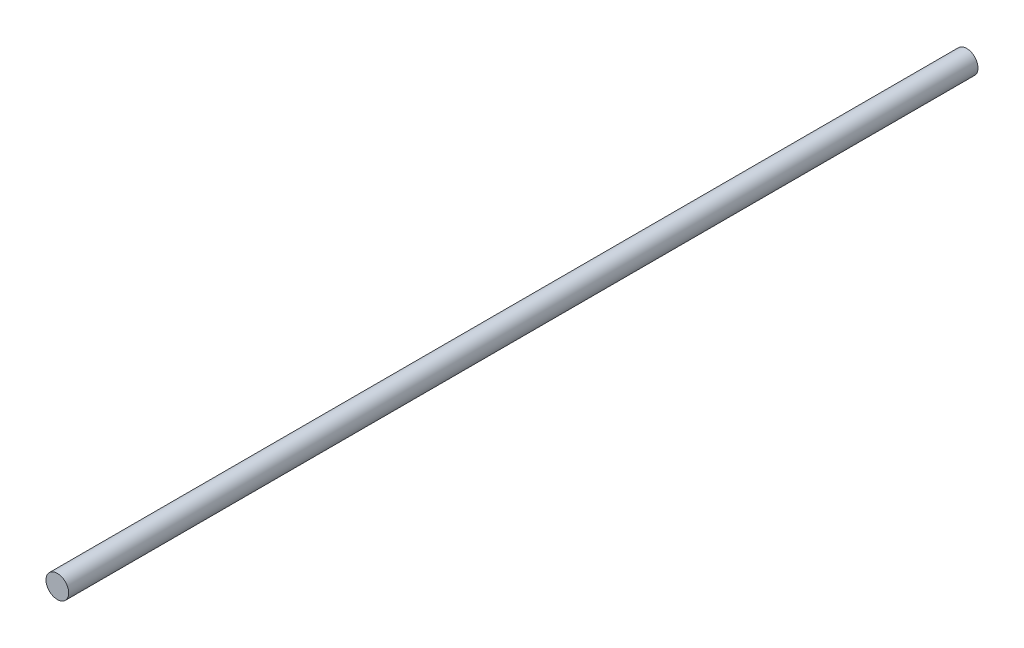
ISO-10303-21;
HEADER;
FILE_DESCRIPTION(('STEP AP214'),'2;1');
FILE_NAME('part.step','',(''),(''),'','','');
FILE_SCHEMA(('AUTOMOTIVE_DESIGN { 1 0 10303 214 1 1 1 1 }'));
ENDSEC;
DATA;
#1=APPLICATION_CONTEXT('core data for automotive mechanical design processes');
#2=APPLICATION_PROTOCOL_DEFINITION('international standard','automotive_design',2000,#1);
#3=PRODUCT_CONTEXT('',#1,'mechanical');
#4=PRODUCT('Part','Part','',(#3));
#5=PRODUCT_RELATED_PRODUCT_CATEGORY('part','',(#4));
#6=PRODUCT_DEFINITION_FORMATION('','',#4);
#7=PRODUCT_DEFINITION_CONTEXT('part definition',#1,'design');
#8=PRODUCT_DEFINITION('design','',#6,#7);
#9=PRODUCT_DEFINITION_SHAPE('','',#8);
#10=(LENGTH_UNIT() NAMED_UNIT(*) SI_UNIT(.MILLI.,.METRE.));
#11=(NAMED_UNIT(*) PLANE_ANGLE_UNIT() SI_UNIT($,.RADIAN.));
#12=(NAMED_UNIT(*) SI_UNIT($,.STERADIAN.) SOLID_ANGLE_UNIT());
#13=UNCERTAINTY_MEASURE_WITH_UNIT(LENGTH_MEASURE(1.E-05),#10,'distance_accuracy_value','');
#14=(GEOMETRIC_REPRESENTATION_CONTEXT(3) GLOBAL_UNCERTAINTY_ASSIGNED_CONTEXT((#13)) GLOBAL_UNIT_ASSIGNED_CONTEXT((#10,
#11,#12)) REPRESENTATION_CONTEXT('',''));
#15=CARTESIAN_POINT('',(0.,0.,0.));
#16=DIRECTION('',(0.,0.,1.));
#17=DIRECTION('',(1.,0.,0.));
#18=AXIS2_PLACEMENT_3D('',#15,#16,#17);
#19=CARTESIAN_POINT('',(0.,0.,120.));
#20=DIRECTION('',(0.,0.,-1.));
#21=DIRECTION('',(-1.,0.,0.));
#22=AXIS2_PLACEMENT_3D('',#19,#20,#21);
#23=CYLINDRICAL_SURFACE('',#22,1.5);
#24=CARTESIAN_POINT('',(0.,0.,120.));
#25=DIRECTION('',(0.,0.,1.));
#26=DIRECTION('',(1.,0.,0.));
#27=AXIS2_PLACEMENT_3D('',#24,#25,#26);
#28=CIRCLE('',#27,1.5);
#29=CARTESIAN_POINT('',(1.5,0.,120.));
#30=VERTEX_POINT('',#29);
#31=EDGE_CURVE('E10',#30,#30,#28,.T.);
#32=ORIENTED_EDGE('',*,*,#31,.F.);
#33=EDGE_LOOP('',(#32));
#34=FACE_BOUND('',#33,.T.);
#35=CARTESIAN_POINT('',(0.,0.,0.));
#36=DIRECTION('',(0.,0.,1.));
#37=DIRECTION('',(1.,0.,0.));
#38=AXIS2_PLACEMENT_3D('',#35,#36,#37);
#39=CIRCLE('',#38,1.5);
#40=CARTESIAN_POINT('',(1.5,0.,0.));
#41=VERTEX_POINT('',#40);
#42=EDGE_CURVE('E50',#41,#41,#39,.T.);
#43=ORIENTED_EDGE('',*,*,#42,.T.);
#44=EDGE_LOOP('',(#43));
#45=FACE_BOUND('',#44,.T.);
#46=ADVANCED_FACE('F47',(#34,#45),#23,.T.);
#47=CARTESIAN_POINT('',(0.,0.,120.));
#48=DIRECTION('',(0.,0.,1.));
#49=DIRECTION('',(1.,0.,0.));
#50=AXIS2_PLACEMENT_3D('',#47,#48,#49);
#51=PLANE('',#50);
#52=ORIENTED_EDGE('',*,*,#31,.T.);
#53=EDGE_LOOP('',(#52));
#54=FACE_BOUND('',#53,.T.);
#55=ADVANCED_FACE('F62',(#54),#51,.T.);
#56=CARTESIAN_POINT('',(0.,0.,0.));
#57=DIRECTION('',(0.,0.,1.));
#58=DIRECTION('',(1.,0.,0.));
#59=AXIS2_PLACEMENT_3D('',#56,#57,#58);
#60=PLANE('',#59);
#61=ORIENTED_EDGE('',*,*,#42,.F.);
#62=EDGE_LOOP('',(#61));
#63=FACE_BOUND('',#62,.T.);
#64=ADVANCED_FACE('F60',(#63),#60,.F.);
#65=CLOSED_SHELL('',(#46,#55,#64));
#66=MANIFOLD_SOLID_BREP('B2',#65);
#67=ADVANCED_BREP_SHAPE_REPRESENTATION('',(#18,#66),#14);
#68=SHAPE_DEFINITION_REPRESENTATION(#9,#67);
ENDSEC;
END-ISO-10303-21;
